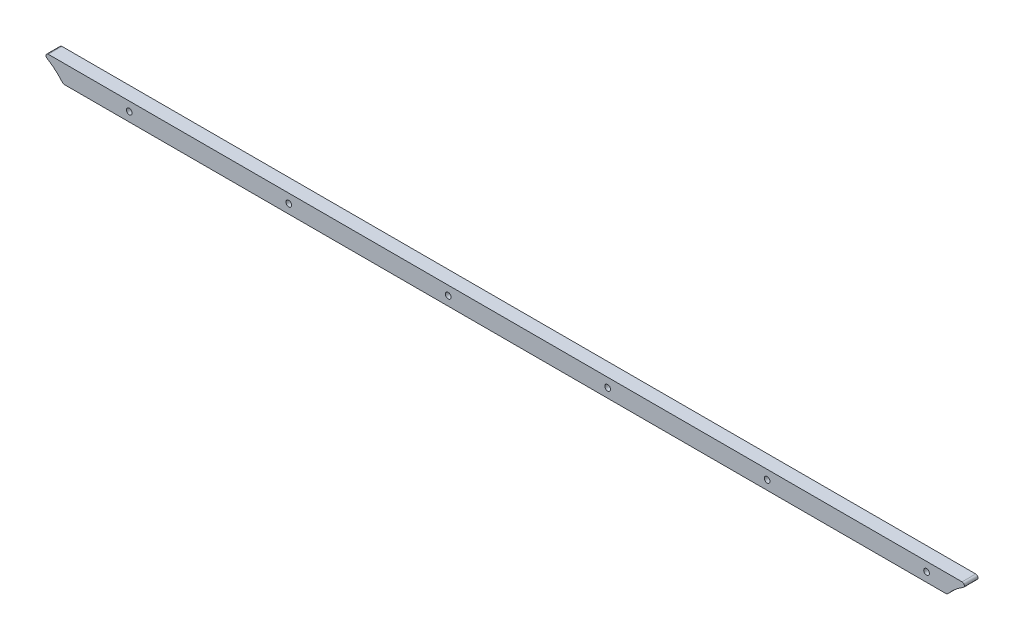
ISO-10303-21;
HEADER;
FILE_DESCRIPTION(('STEP AP214'),'2;1');
FILE_NAME('part.step','',(''),(''),'','','');
FILE_SCHEMA(('AUTOMOTIVE_DESIGN { 1 0 10303 214 1 1 1 1 }'));
ENDSEC;
DATA;
#1=APPLICATION_CONTEXT('core data for automotive mechanical design processes');
#2=APPLICATION_PROTOCOL_DEFINITION('international standard','automotive_design',2000,#1);
#3=PRODUCT_CONTEXT('',#1,'mechanical');
#4=PRODUCT('Part','Part','',(#3));
#5=PRODUCT_RELATED_PRODUCT_CATEGORY('part','',(#4));
#6=PRODUCT_DEFINITION_FORMATION('','',#4);
#7=PRODUCT_DEFINITION_CONTEXT('part definition',#1,'design');
#8=PRODUCT_DEFINITION('design','',#6,#7);
#9=PRODUCT_DEFINITION_SHAPE('','',#8);
#10=(LENGTH_UNIT() NAMED_UNIT(*) SI_UNIT(.MILLI.,.METRE.));
#11=(NAMED_UNIT(*) PLANE_ANGLE_UNIT() SI_UNIT($,.RADIAN.));
#12=(NAMED_UNIT(*) SI_UNIT($,.STERADIAN.) SOLID_ANGLE_UNIT());
#13=UNCERTAINTY_MEASURE_WITH_UNIT(LENGTH_MEASURE(1.E-05),#10,'distance_accuracy_value','');
#14=(GEOMETRIC_REPRESENTATION_CONTEXT(3) GLOBAL_UNCERTAINTY_ASSIGNED_CONTEXT((#13)) GLOBAL_UNIT_ASSIGNED_CONTEXT((#10,
#11,#12)) REPRESENTATION_CONTEXT('',''));
#15=CARTESIAN_POINT('',(0.,0.,0.));
#16=DIRECTION('',(0.,0.,1.));
#17=DIRECTION('',(1.,0.,0.));
#18=AXIS2_PLACEMENT_3D('',#15,#16,#17);
#19=CARTESIAN_POINT('',(430.,0.,-8.5));
#20=DIRECTION('',(0.,0.,1.));
#21=DIRECTION('',(1.,0.,0.));
#22=AXIS2_PLACEMENT_3D('',#19,#20,#21);
#23=CYLINDRICAL_SURFACE('',#22,27.);
#24=CARTESIAN_POINT('',(430.,0.,-8.5));
#25=DIRECTION('',(0.,0.,-1.));
#26=DIRECTION('',(1.,0.,0.));
#27=AXIS2_PLACEMENT_3D('',#24,#25,#26);
#28=CIRCLE('',#27,27.);
#29=CARTESIAN_POINT('',(409.318375502956,17.3571428571429,-8.5));
#30=VERTEX_POINT('',#29);
#31=CARTESIAN_POINT('',(416.092873651782,23.1428571428572,-8.5));
#32=VERTEX_POINT('',#31);
#33=EDGE_CURVE('E181',#30,#32,#28,.T.);
#34=ORIENTED_EDGE('',*,*,#33,.T.);
#35=DIRECTION('',(0.,0.,1.));
#36=VECTOR('',#35,1.);
#37=CARTESIAN_POINT('',(416.092873651782,23.1428571428572,-8.5));
#38=LINE('',#37,#36);
#39=CARTESIAN_POINT('',(416.092873651782,23.1428571428572,-2.5));
#40=VERTEX_POINT('',#39);
#41=EDGE_CURVE('E130',#32,#40,#38,.T.);
#42=ORIENTED_EDGE('',*,*,#41,.T.);
#43=CARTESIAN_POINT('',(430.,0.,-2.5));
#44=DIRECTION('',(0.,0.,-1.));
#45=DIRECTION('',(1.,0.,0.));
#46=AXIS2_PLACEMENT_3D('',#43,#44,#45);
#47=CIRCLE('',#46,27.);
#48=CARTESIAN_POINT('',(409.318375502956,17.3571428571429,-2.5));
#49=VERTEX_POINT('',#48);
#50=EDGE_CURVE('E114',#49,#40,#47,.T.);
#51=ORIENTED_EDGE('',*,*,#50,.F.);
#52=DIRECTION('',(0.,0.,1.));
#53=VECTOR('',#52,1.);
#54=CARTESIAN_POINT('',(409.318375502956,17.3571428571429,-8.5));
#55=LINE('',#54,#53);
#56=EDGE_CURVE('E127',#49,#30,#55,.F.);
#57=ORIENTED_EDGE('',*,*,#56,.T.);
#58=EDGE_LOOP('',(#34,#42,#51,#57));
#59=FACE_BOUND('',#58,.T.);
#60=ADVANCED_FACE('F43',(#59),#23,.F.);
#61=CARTESIAN_POINT('',(225.,17.,-8.5));
#62=DIRECTION('',(0.,-1.,0.));
#63=DIRECTION('',(1.,0.,0.));
#64=AXIS2_PLACEMENT_3D('',#61,#62,#63);
#65=PLANE('',#64);
#66=DIRECTION('',(1.,0.,0.));
#67=VECTOR('',#66,1.);
#68=CARTESIAN_POINT('',(225.,17.,-8.5));
#69=LINE('',#68,#67);
#70=CARTESIAN_POINT('',(21.4476105895273,17.,-8.5));
#71=VERTEX_POINT('',#70);
#72=CARTESIAN_POINT('',(408.552389410473,17.,-8.5));
#73=VERTEX_POINT('',#72);
#74=EDGE_CURVE('E138',#71,#73,#69,.T.);
#75=ORIENTED_EDGE('',*,*,#74,.T.);
#76=DIRECTION('',(0.,0.,1.));
#77=VECTOR('',#76,1.);
#78=CARTESIAN_POINT('',(408.552389410473,17.,-8.5));
#79=LINE('',#78,#77);
#80=CARTESIAN_POINT('',(408.552389410473,17.,-2.5));
#81=VERTEX_POINT('',#80);
#82=EDGE_CURVE('E166',#73,#81,#79,.T.);
#83=ORIENTED_EDGE('',*,*,#82,.T.);
#84=DIRECTION('',(1.,0.,0.));
#85=VECTOR('',#84,1.);
#86=CARTESIAN_POINT('',(225.,17.,-2.5));
#87=LINE('',#86,#85);
#88=CARTESIAN_POINT('',(21.4476105895272,17.,-2.5));
#89=VERTEX_POINT('',#88);
#90=EDGE_CURVE('E116',#89,#81,#87,.T.);
#91=ORIENTED_EDGE('',*,*,#90,.F.);
#92=DIRECTION('',(0.,0.,1.));
#93=VECTOR('',#92,1.);
#94=CARTESIAN_POINT('',(21.4476105895272,17.,-8.5));
#95=LINE('',#94,#93);
#96=EDGE_CURVE('E164',#89,#71,#95,.F.);
#97=ORIENTED_EDGE('',*,*,#96,.T.);
#98=EDGE_LOOP('',(#75,#83,#91,#97));
#99=FACE_BOUND('',#98,.T.);
#100=ADVANCED_FACE('F170',(#99),#65,.T.);
#101=CARTESIAN_POINT('',(0.,0.,-8.5));
#102=DIRECTION('',(0.,0.,1.));
#103=DIRECTION('',(1.,0.,0.));
#104=AXIS2_PLACEMENT_3D('',#101,#102,#103);
#105=CYLINDRICAL_SURFACE('',#104,27.);
#106=CARTESIAN_POINT('',(0.,0.,-8.5));
#107=DIRECTION('',(0.,0.,-1.));
#108=DIRECTION('',(1.,0.,0.));
#109=AXIS2_PLACEMENT_3D('',#106,#107,#108);
#110=CIRCLE('',#109,27.);
#111=CARTESIAN_POINT('',(13.9071263482183,23.1428571428571,-8.5));
#112=VERTEX_POINT('',#111);
#113=CARTESIAN_POINT('',(20.6816244970441,17.3571428571429,-8.5));
#114=VERTEX_POINT('',#113);
#115=EDGE_CURVE('E145',#112,#114,#110,.T.);
#116=ORIENTED_EDGE('',*,*,#115,.T.);
#117=DIRECTION('',(0.,0.,1.));
#118=VECTOR('',#117,1.);
#119=CARTESIAN_POINT('',(20.6816244970441,17.3571428571429,-8.5));
#120=LINE('',#119,#118);
#121=CARTESIAN_POINT('',(20.6816244970441,17.3571428571429,-2.5));
#122=VERTEX_POINT('',#121);
#123=EDGE_CURVE('E11',#114,#122,#120,.T.);
#124=ORIENTED_EDGE('',*,*,#123,.T.);
#125=CARTESIAN_POINT('',(0.,0.,-2.5));
#126=DIRECTION('',(0.,0.,-1.));
#127=DIRECTION('',(1.,0.,0.));
#128=AXIS2_PLACEMENT_3D('',#125,#126,#127);
#129=CIRCLE('',#128,27.);
#130=CARTESIAN_POINT('',(13.9071263482183,23.1428571428571,-2.5));
#131=VERTEX_POINT('',#130);
#132=EDGE_CURVE('E179',#131,#122,#129,.T.);
#133=ORIENTED_EDGE('',*,*,#132,.F.);
#134=DIRECTION('',(0.,0.,1.));
#135=VECTOR('',#134,1.);
#136=CARTESIAN_POINT('',(13.9071263482183,23.1428571428571,-8.5));
#137=LINE('',#136,#135);
#138=EDGE_CURVE('E51',#131,#112,#137,.F.);
#139=ORIENTED_EDGE('',*,*,#138,.T.);
#140=EDGE_LOOP('',(#116,#124,#133,#139));
#141=FACE_BOUND('',#140,.T.);
#142=ADVANCED_FACE('F178',(#141),#105,.F.);
#143=CARTESIAN_POINT('',(10.1980390271856,25.,-8.5));
#144=DIRECTION('',(0.,1.,0.));
#145=DIRECTION('',(-1.,0.,0.));
#146=AXIS2_PLACEMENT_3D('',#143,#144,#145);
#147=PLANE('',#146);
#148=DIRECTION('',(-1.,0.,0.));
#149=VECTOR('',#148,1.);
#150=CARTESIAN_POINT('',(10.1980390271856,25.,-2.5));
#151=LINE('',#150,#149);
#152=CARTESIAN_POINT('',(415.577794898144,25.,-2.5));
#153=VERTEX_POINT('',#152);
#154=CARTESIAN_POINT('',(14.422205101856,25.,-2.5));
#155=VERTEX_POINT('',#154);
#156=EDGE_CURVE('E131',#153,#155,#151,.T.);
#157=ORIENTED_EDGE('',*,*,#156,.F.);
#158=DIRECTION('',(0.,0.,1.));
#159=VECTOR('',#158,1.);
#160=CARTESIAN_POINT('',(415.577794898144,25.,-8.5));
#161=LINE('',#160,#159);
#162=CARTESIAN_POINT('',(415.577794898144,25.,-8.5));
#163=VERTEX_POINT('',#162);
#164=EDGE_CURVE('E156',#153,#163,#161,.F.);
#165=ORIENTED_EDGE('',*,*,#164,.T.);
#166=DIRECTION('',(-1.,0.,0.));
#167=VECTOR('',#166,1.);
#168=CARTESIAN_POINT('',(10.1980390271856,25.,-8.5));
#169=LINE('',#168,#167);
#170=CARTESIAN_POINT('',(14.422205101856,25.,-8.5));
#171=VERTEX_POINT('',#170);
#172=EDGE_CURVE('E185',#163,#171,#169,.T.);
#173=ORIENTED_EDGE('',*,*,#172,.T.);
#174=DIRECTION('',(0.,0.,1.));
#175=VECTOR('',#174,1.);
#176=CARTESIAN_POINT('',(14.422205101856,25.,-8.5));
#177=LINE('',#176,#175);
#178=EDGE_CURVE('E153',#171,#155,#177,.T.);
#179=ORIENTED_EDGE('',*,*,#178,.T.);
#180=EDGE_LOOP('',(#157,#165,#173,#179));
#181=FACE_BOUND('',#180,.T.);
#182=ADVANCED_FACE('F264',(#181),#147,.T.);
#183=CARTESIAN_POINT('',(430.,0.,-8.5));
#184=DIRECTION('',(0.,0.,1.));
#185=DIRECTION('',(1.,0.,0.));
#186=AXIS2_PLACEMENT_3D('',#183,#184,#185);
#187=PLANE('',#186);
#188=CARTESIAN_POINT('',(400.,21.,-8.5));
#189=DIRECTION('',(0.,0.,1.));
#190=DIRECTION('',(1.,0.,0.));
#191=AXIS2_PLACEMENT_3D('',#188,#189,#190);
#192=CIRCLE('',#191,1.24999999999997);
#193=CARTESIAN_POINT('',(401.25,21.,-8.5));
#194=VERTEX_POINT('',#193);
#195=EDGE_CURVE('E218',#194,#194,#192,.T.);
#196=ORIENTED_EDGE('',*,*,#195,.T.);
#197=EDGE_LOOP('',(#196));
#198=FACE_BOUND('',#197,.T.);
#199=CARTESIAN_POINT('',(330.,21.,-8.5));
#200=DIRECTION('',(0.,0.,1.));
#201=DIRECTION('',(1.,0.,0.));
#202=AXIS2_PLACEMENT_3D('',#199,#200,#201);
#203=CIRCLE('',#202,1.24999999999997);
#204=CARTESIAN_POINT('',(331.25,21.,-8.5));
#205=VERTEX_POINT('',#204);
#206=EDGE_CURVE('E212',#205,#205,#203,.T.);
#207=ORIENTED_EDGE('',*,*,#206,.T.);
#208=EDGE_LOOP('',(#207));
#209=FACE_BOUND('',#208,.T.);
#210=CARTESIAN_POINT('',(260.,21.,-8.5));
#211=DIRECTION('',(0.,0.,1.));
#212=DIRECTION('',(1.,0.,0.));
#213=AXIS2_PLACEMENT_3D('',#210,#211,#212);
#214=CIRCLE('',#213,1.24999999999997);
#215=CARTESIAN_POINT('',(261.25,21.,-8.5));
#216=VERTEX_POINT('',#215);
#217=EDGE_CURVE('E206',#216,#216,#214,.T.);
#218=ORIENTED_EDGE('',*,*,#217,.T.);
#219=EDGE_LOOP('',(#218));
#220=FACE_BOUND('',#219,.T.);
#221=CARTESIAN_POINT('',(190.,21.,-8.5));
#222=DIRECTION('',(0.,0.,1.));
#223=DIRECTION('',(1.,0.,0.));
#224=AXIS2_PLACEMENT_3D('',#221,#222,#223);
#225=CIRCLE('',#224,1.25);
#226=CARTESIAN_POINT('',(191.25,21.,-8.5));
#227=VERTEX_POINT('',#226);
#228=EDGE_CURVE('E200',#227,#227,#225,.T.);
#229=ORIENTED_EDGE('',*,*,#228,.T.);
#230=EDGE_LOOP('',(#229));
#231=FACE_BOUND('',#230,.T.);
#232=CARTESIAN_POINT('',(120.,21.,-8.5));
#233=DIRECTION('',(0.,0.,1.));
#234=DIRECTION('',(1.,0.,0.));
#235=AXIS2_PLACEMENT_3D('',#232,#233,#234);
#236=CIRCLE('',#235,1.25);
#237=CARTESIAN_POINT('',(121.25,21.,-8.5));
#238=VERTEX_POINT('',#237);
#239=EDGE_CURVE('E194',#238,#238,#236,.T.);
#240=ORIENTED_EDGE('',*,*,#239,.T.);
#241=EDGE_LOOP('',(#240));
#242=FACE_BOUND('',#241,.T.);
#243=CARTESIAN_POINT('',(49.9999999999999,21.,-8.5));
#244=DIRECTION('',(0.,0.,1.));
#245=DIRECTION('',(1.,0.,0.));
#246=AXIS2_PLACEMENT_3D('',#243,#244,#245);
#247=CIRCLE('',#246,1.25);
#248=CARTESIAN_POINT('',(51.2499999999999,21.,-8.5));
#249=VERTEX_POINT('',#248);
#250=EDGE_CURVE('E132',#249,#249,#247,.T.);
#251=ORIENTED_EDGE('',*,*,#250,.T.);
#252=EDGE_LOOP('',(#251));
#253=FACE_BOUND('',#252,.T.);
#254=ORIENTED_EDGE('',*,*,#172,.F.);
#255=CARTESIAN_POINT('',(415.577794898144,24.,-8.5));
#256=DIRECTION('',(0.,0.,1.));
#257=DIRECTION('',(1.,0.,0.));
#258=AXIS2_PLACEMENT_3D('',#255,#256,#257);
#259=CIRCLE('',#258,1.);
#260=EDGE_CURVE('E162',#163,#32,#259,.F.);
#261=ORIENTED_EDGE('',*,*,#260,.T.);
#262=ORIENTED_EDGE('',*,*,#33,.F.);
#263=CARTESIAN_POINT('',(408.552389410473,18.,-8.5));
#264=DIRECTION('',(0.,0.,1.));
#265=DIRECTION('',(1.,0.,0.));
#266=AXIS2_PLACEMENT_3D('',#263,#264,#265);
#267=CIRCLE('',#266,1.);
#268=EDGE_CURVE('E136',#30,#73,#267,.F.);
#269=ORIENTED_EDGE('',*,*,#268,.T.);
#270=ORIENTED_EDGE('',*,*,#74,.F.);
#271=CARTESIAN_POINT('',(21.4476105895272,18.,-8.5));
#272=DIRECTION('',(0.,0.,1.));
#273=DIRECTION('',(1.,0.,0.));
#274=AXIS2_PLACEMENT_3D('',#271,#272,#273);
#275=CIRCLE('',#274,1.);
#276=EDGE_CURVE('E58',#71,#114,#275,.F.);
#277=ORIENTED_EDGE('',*,*,#276,.T.);
#278=ORIENTED_EDGE('',*,*,#115,.F.);
#279=CARTESIAN_POINT('',(14.422205101856,24.,-8.5));
#280=DIRECTION('',(0.,0.,1.));
#281=DIRECTION('',(1.,0.,0.));
#282=AXIS2_PLACEMENT_3D('',#279,#280,#281);
#283=CIRCLE('',#282,1.);
#284=EDGE_CURVE('E158',#112,#171,#283,.F.);
#285=ORIENTED_EDGE('',*,*,#284,.T.);
#286=EDGE_LOOP('',(#254,#261,#262,#269,#270,#277,#278,#285));
#287=FACE_BOUND('',#286,.T.);
#288=ADVANCED_FACE('F173',(#198,#209,#220,#231,#242,#253,#287),#187,.F.);
#289=CARTESIAN_POINT('',(430.,0.,-2.5));
#290=DIRECTION('',(0.,0.,1.));
#291=DIRECTION('',(1.,0.,0.));
#292=AXIS2_PLACEMENT_3D('',#289,#290,#291);
#293=PLANE('',#292);
#294=CARTESIAN_POINT('',(400.,21.,-2.5));
#295=DIRECTION('',(0.,0.,1.));
#296=DIRECTION('',(1.,0.,0.));
#297=AXIS2_PLACEMENT_3D('',#294,#295,#296);
#298=CIRCLE('',#297,1.24999999999997);
#299=CARTESIAN_POINT('',(401.25,21.,-2.5));
#300=VERTEX_POINT('',#299);
#301=EDGE_CURVE('E221',#300,#300,#298,.T.);
#302=ORIENTED_EDGE('',*,*,#301,.F.);
#303=EDGE_LOOP('',(#302));
#304=FACE_BOUND('',#303,.T.);
#305=CARTESIAN_POINT('',(330.,21.,-2.5));
#306=DIRECTION('',(0.,0.,1.));
#307=DIRECTION('',(1.,0.,0.));
#308=AXIS2_PLACEMENT_3D('',#305,#306,#307);
#309=CIRCLE('',#308,1.24999999999997);
#310=CARTESIAN_POINT('',(331.25,21.,-2.5));
#311=VERTEX_POINT('',#310);
#312=EDGE_CURVE('E215',#311,#311,#309,.T.);
#313=ORIENTED_EDGE('',*,*,#312,.F.);
#314=EDGE_LOOP('',(#313));
#315=FACE_BOUND('',#314,.T.);
#316=CARTESIAN_POINT('',(260.,21.,-2.5));
#317=DIRECTION('',(0.,0.,1.));
#318=DIRECTION('',(1.,0.,0.));
#319=AXIS2_PLACEMENT_3D('',#316,#317,#318);
#320=CIRCLE('',#319,1.24999999999997);
#321=CARTESIAN_POINT('',(261.25,21.,-2.5));
#322=VERTEX_POINT('',#321);
#323=EDGE_CURVE('E209',#322,#322,#320,.T.);
#324=ORIENTED_EDGE('',*,*,#323,.F.);
#325=EDGE_LOOP('',(#324));
#326=FACE_BOUND('',#325,.T.);
#327=CARTESIAN_POINT('',(190.,21.,-2.5));
#328=DIRECTION('',(0.,0.,1.));
#329=DIRECTION('',(1.,0.,0.));
#330=AXIS2_PLACEMENT_3D('',#327,#328,#329);
#331=CIRCLE('',#330,1.25);
#332=CARTESIAN_POINT('',(191.25,21.,-2.5));
#333=VERTEX_POINT('',#332);
#334=EDGE_CURVE('E203',#333,#333,#331,.T.);
#335=ORIENTED_EDGE('',*,*,#334,.F.);
#336=EDGE_LOOP('',(#335));
#337=FACE_BOUND('',#336,.T.);
#338=CARTESIAN_POINT('',(120.,21.,-2.5));
#339=DIRECTION('',(0.,0.,1.));
#340=DIRECTION('',(1.,0.,0.));
#341=AXIS2_PLACEMENT_3D('',#338,#339,#340);
#342=CIRCLE('',#341,1.25);
#343=CARTESIAN_POINT('',(121.25,21.,-2.5));
#344=VERTEX_POINT('',#343);
#345=EDGE_CURVE('E197',#344,#344,#342,.T.);
#346=ORIENTED_EDGE('',*,*,#345,.F.);
#347=EDGE_LOOP('',(#346));
#348=FACE_BOUND('',#347,.T.);
#349=CARTESIAN_POINT('',(49.9999999999999,21.,-2.5));
#350=DIRECTION('',(0.,0.,1.));
#351=DIRECTION('',(1.,0.,0.));
#352=AXIS2_PLACEMENT_3D('',#349,#350,#351);
#353=CIRCLE('',#352,1.25);
#354=CARTESIAN_POINT('',(51.2499999999999,21.,-2.5));
#355=VERTEX_POINT('',#354);
#356=EDGE_CURVE('E191',#355,#355,#353,.T.);
#357=ORIENTED_EDGE('',*,*,#356,.F.);
#358=EDGE_LOOP('',(#357));
#359=FACE_BOUND('',#358,.T.);
#360=ORIENTED_EDGE('',*,*,#50,.T.);
#361=CARTESIAN_POINT('',(415.577794898144,24.,-2.5));
#362=DIRECTION('',(0.,0.,1.));
#363=DIRECTION('',(1.,0.,0.));
#364=AXIS2_PLACEMENT_3D('',#361,#362,#363);
#365=CIRCLE('',#364,1.);
#366=EDGE_CURVE('E121',#40,#153,#365,.T.);
#367=ORIENTED_EDGE('',*,*,#366,.T.);
#368=ORIENTED_EDGE('',*,*,#156,.T.);
#369=CARTESIAN_POINT('',(14.422205101856,24.,-2.5));
#370=DIRECTION('',(0.,0.,1.));
#371=DIRECTION('',(1.,0.,0.));
#372=AXIS2_PLACEMENT_3D('',#369,#370,#371);
#373=CIRCLE('',#372,1.);
#374=EDGE_CURVE('E141',#155,#131,#373,.T.);
#375=ORIENTED_EDGE('',*,*,#374,.T.);
#376=ORIENTED_EDGE('',*,*,#132,.T.);
#377=CARTESIAN_POINT('',(21.4476105895272,18.,-2.5));
#378=DIRECTION('',(0.,0.,1.));
#379=DIRECTION('',(1.,0.,0.));
#380=AXIS2_PLACEMENT_3D('',#377,#378,#379);
#381=CIRCLE('',#380,1.);
#382=EDGE_CURVE('E122',#122,#89,#381,.T.);
#383=ORIENTED_EDGE('',*,*,#382,.T.);
#384=ORIENTED_EDGE('',*,*,#90,.T.);
#385=CARTESIAN_POINT('',(408.552389410473,18.,-2.5));
#386=DIRECTION('',(0.,0.,1.));
#387=DIRECTION('',(1.,0.,0.));
#388=AXIS2_PLACEMENT_3D('',#385,#386,#387);
#389=CIRCLE('',#388,1.);
#390=EDGE_CURVE('E111',#81,#49,#389,.T.);
#391=ORIENTED_EDGE('',*,*,#390,.T.);
#392=EDGE_LOOP('',(#360,#367,#368,#375,#376,#383,#384,#391));
#393=FACE_BOUND('',#392,.T.);
#394=ADVANCED_FACE('F113',(#304,#315,#326,#337,#348,#359,#393),#293,.T.);
#395=CARTESIAN_POINT('',(415.577794898144,24.,-8.5));
#396=DIRECTION('',(0.,0.,1.));
#397=DIRECTION('',(1.,0.,0.));
#398=AXIS2_PLACEMENT_3D('',#395,#396,#397);
#399=CYLINDRICAL_SURFACE('',#398,1.);
#400=ORIENTED_EDGE('',*,*,#260,.F.);
#401=ORIENTED_EDGE('',*,*,#164,.F.);
#402=ORIENTED_EDGE('',*,*,#366,.F.);
#403=ORIENTED_EDGE('',*,*,#41,.F.);
#404=EDGE_LOOP('',(#400,#401,#402,#403));
#405=FACE_BOUND('',#404,.T.);
#406=ADVANCED_FACE('F229',(#405),#399,.T.);
#407=CARTESIAN_POINT('',(408.552389410473,18.,-8.5));
#408=DIRECTION('',(0.,0.,1.));
#409=DIRECTION('',(1.,0.,0.));
#410=AXIS2_PLACEMENT_3D('',#407,#408,#409);
#411=CYLINDRICAL_SURFACE('',#410,1.);
#412=ORIENTED_EDGE('',*,*,#268,.F.);
#413=ORIENTED_EDGE('',*,*,#56,.F.);
#414=ORIENTED_EDGE('',*,*,#390,.F.);
#415=ORIENTED_EDGE('',*,*,#82,.F.);
#416=EDGE_LOOP('',(#412,#413,#414,#415));
#417=FACE_BOUND('',#416,.T.);
#418=ADVANCED_FACE('F135',(#417),#411,.T.);
#419=CARTESIAN_POINT('',(21.4476105895272,18.,-8.5));
#420=DIRECTION('',(0.,0.,1.));
#421=DIRECTION('',(1.,0.,0.));
#422=AXIS2_PLACEMENT_3D('',#419,#420,#421);
#423=CYLINDRICAL_SURFACE('',#422,1.);
#424=ORIENTED_EDGE('',*,*,#276,.F.);
#425=ORIENTED_EDGE('',*,*,#96,.F.);
#426=ORIENTED_EDGE('',*,*,#382,.F.);
#427=ORIENTED_EDGE('',*,*,#123,.F.);
#428=EDGE_LOOP('',(#424,#425,#426,#427));
#429=FACE_BOUND('',#428,.T.);
#430=ADVANCED_FACE('F176',(#429),#423,.T.);
#431=CARTESIAN_POINT('',(14.422205101856,24.,-8.5));
#432=DIRECTION('',(0.,0.,1.));
#433=DIRECTION('',(1.,0.,0.));
#434=AXIS2_PLACEMENT_3D('',#431,#432,#433);
#435=CYLINDRICAL_SURFACE('',#434,1.);
#436=ORIENTED_EDGE('',*,*,#284,.F.);
#437=ORIENTED_EDGE('',*,*,#138,.F.);
#438=ORIENTED_EDGE('',*,*,#374,.F.);
#439=ORIENTED_EDGE('',*,*,#178,.F.);
#440=EDGE_LOOP('',(#436,#437,#438,#439));
#441=FACE_BOUND('',#440,.T.);
#442=ADVANCED_FACE('F45',(#441),#435,.T.);
#443=CARTESIAN_POINT('',(49.9999999999999,21.,-2.5));
#444=DIRECTION('',(0.,0.,1.));
#445=DIRECTION('',(1.,0.,0.));
#446=AXIS2_PLACEMENT_3D('',#443,#444,#445);
#447=CYLINDRICAL_SURFACE('',#446,1.25);
#448=ORIENTED_EDGE('',*,*,#250,.F.);
#449=EDGE_LOOP('',(#448));
#450=FACE_BOUND('',#449,.T.);
#451=ORIENTED_EDGE('',*,*,#356,.T.);
#452=EDGE_LOOP('',(#451));
#453=FACE_BOUND('',#452,.T.);
#454=ADVANCED_FACE('F241',(#450,#453),#447,.F.);
#455=CARTESIAN_POINT('',(120.,21.,-2.5));
#456=DIRECTION('',(0.,0.,1.));
#457=DIRECTION('',(1.,0.,0.));
#458=AXIS2_PLACEMENT_3D('',#455,#456,#457);
#459=CYLINDRICAL_SURFACE('',#458,1.25);
#460=ORIENTED_EDGE('',*,*,#239,.F.);
#461=EDGE_LOOP('',(#460));
#462=FACE_BOUND('',#461,.T.);
#463=ORIENTED_EDGE('',*,*,#345,.T.);
#464=EDGE_LOOP('',(#463));
#465=FACE_BOUND('',#464,.T.);
#466=ADVANCED_FACE('F243',(#462,#465),#459,.F.);
#467=CARTESIAN_POINT('',(190.,21.,-2.5));
#468=DIRECTION('',(0.,0.,1.));
#469=DIRECTION('',(1.,0.,0.));
#470=AXIS2_PLACEMENT_3D('',#467,#468,#469);
#471=CYLINDRICAL_SURFACE('',#470,1.25);
#472=ORIENTED_EDGE('',*,*,#228,.F.);
#473=EDGE_LOOP('',(#472));
#474=FACE_BOUND('',#473,.T.);
#475=ORIENTED_EDGE('',*,*,#334,.T.);
#476=EDGE_LOOP('',(#475));
#477=FACE_BOUND('',#476,.T.);
#478=ADVANCED_FACE('F249',(#474,#477),#471,.F.);
#479=CARTESIAN_POINT('',(260.,21.,-2.5));
#480=DIRECTION('',(0.,0.,1.));
#481=DIRECTION('',(1.,0.,0.));
#482=AXIS2_PLACEMENT_3D('',#479,#480,#481);
#483=CYLINDRICAL_SURFACE('',#482,1.24999999999997);
#484=ORIENTED_EDGE('',*,*,#217,.F.);
#485=EDGE_LOOP('',(#484));
#486=FACE_BOUND('',#485,.T.);
#487=ORIENTED_EDGE('',*,*,#323,.T.);
#488=EDGE_LOOP('',(#487));
#489=FACE_BOUND('',#488,.T.);
#490=ADVANCED_FACE('F324',(#486,#489),#483,.F.);
#491=CARTESIAN_POINT('',(330.,21.,-2.5));
#492=DIRECTION('',(0.,0.,1.));
#493=DIRECTION('',(1.,0.,0.));
#494=AXIS2_PLACEMENT_3D('',#491,#492,#493);
#495=CYLINDRICAL_SURFACE('',#494,1.24999999999997);
#496=ORIENTED_EDGE('',*,*,#206,.F.);
#497=EDGE_LOOP('',(#496));
#498=FACE_BOUND('',#497,.T.);
#499=ORIENTED_EDGE('',*,*,#312,.T.);
#500=EDGE_LOOP('',(#499));
#501=FACE_BOUND('',#500,.T.);
#502=ADVANCED_FACE('F333',(#498,#501),#495,.F.);
#503=CARTESIAN_POINT('',(400.,21.,-2.5));
#504=DIRECTION('',(0.,0.,1.));
#505=DIRECTION('',(1.,0.,0.));
#506=AXIS2_PLACEMENT_3D('',#503,#504,#505);
#507=CYLINDRICAL_SURFACE('',#506,1.24999999999997);
#508=ORIENTED_EDGE('',*,*,#195,.F.);
#509=EDGE_LOOP('',(#508));
#510=FACE_BOUND('',#509,.T.);
#511=ORIENTED_EDGE('',*,*,#301,.T.);
#512=EDGE_LOOP('',(#511));
#513=FACE_BOUND('',#512,.T.);
#514=ADVANCED_FACE('F225',(#510,#513),#507,.F.);
#515=CLOSED_SHELL('',(#60,#100,#142,#182,#288,#394,#406,#418,#430,#442,#454,#466,#478,#490,#502,#514));
#516=MANIFOLD_SOLID_BREP('B2',#515);
#517=ADVANCED_BREP_SHAPE_REPRESENTATION('',(#18,#516),#14);
#518=SHAPE_DEFINITION_REPRESENTATION(#9,#517);
ENDSEC;
END-ISO-10303-21;
